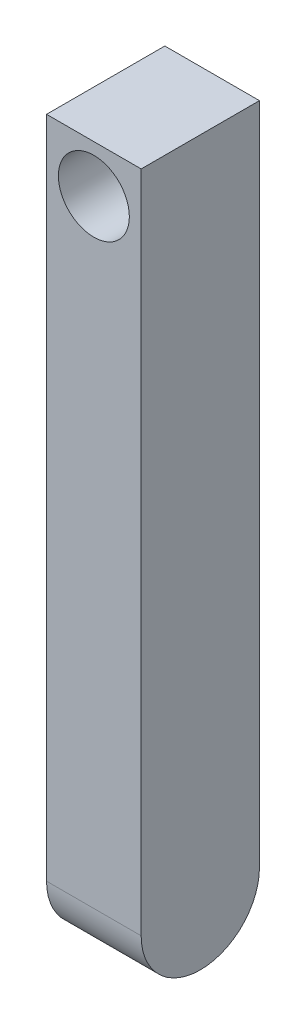
ISO-10303-21;
HEADER;
FILE_DESCRIPTION(('STEP AP214'),'2;1');
FILE_NAME('part.step','',(''),(''),'','','');
FILE_SCHEMA(('AUTOMOTIVE_DESIGN { 1 0 10303 214 1 1 1 1 }'));
ENDSEC;
DATA;
#1=APPLICATION_CONTEXT('core data for automotive mechanical design processes');
#2=APPLICATION_PROTOCOL_DEFINITION('international standard','automotive_design',2000,#1);
#3=PRODUCT_CONTEXT('',#1,'mechanical');
#4=PRODUCT('Part','Part','',(#3));
#5=PRODUCT_RELATED_PRODUCT_CATEGORY('part','',(#4));
#6=PRODUCT_DEFINITION_FORMATION('','',#4);
#7=PRODUCT_DEFINITION_CONTEXT('part definition',#1,'design');
#8=PRODUCT_DEFINITION('design','',#6,#7);
#9=PRODUCT_DEFINITION_SHAPE('','',#8);
#10=(LENGTH_UNIT() NAMED_UNIT(*) SI_UNIT(.MILLI.,.METRE.));
#11=(NAMED_UNIT(*) PLANE_ANGLE_UNIT() SI_UNIT($,.RADIAN.));
#12=(NAMED_UNIT(*) SI_UNIT($,.STERADIAN.) SOLID_ANGLE_UNIT());
#13=UNCERTAINTY_MEASURE_WITH_UNIT(LENGTH_MEASURE(1.E-05),#10,'distance_accuracy_value','');
#14=(GEOMETRIC_REPRESENTATION_CONTEXT(3) GLOBAL_UNCERTAINTY_ASSIGNED_CONTEXT((#13)) GLOBAL_UNIT_ASSIGNED_CONTEXT((#10,
#11,#12)) REPRESENTATION_CONTEXT('',''));
#15=CARTESIAN_POINT('',(0.,0.,0.));
#16=DIRECTION('',(0.,0.,1.));
#17=DIRECTION('',(1.,0.,0.));
#18=AXIS2_PLACEMENT_3D('',#15,#16,#17);
#19=CARTESIAN_POINT('',(0.,0.,100.));
#20=DIRECTION('',(0.,0.,1.));
#21=DIRECTION('',(1.,0.,0.));
#22=AXIS2_PLACEMENT_3D('',#19,#20,#21);
#23=PLANE('',#22);
#24=DIRECTION('',(0.,-1.,0.));
#25=VECTOR('',#24,1.);
#26=CARTESIAN_POINT('',(-37.6696208263638,540.470418357068,100.));
#27=LINE('',#26,#25);
#28=CARTESIAN_POINT('',(-37.6696208263638,540.470418357068,100.));
#29=VERTEX_POINT('',#28);
#30=CARTESIAN_POINT('',(-37.6696208263638,-21.0295816429317,100.));
#31=VERTEX_POINT('',#30);
#32=EDGE_CURVE('E86',#29,#31,#27,.T.);
#33=ORIENTED_EDGE('',*,*,#32,.T.);
#34=DIRECTION('',(1.,0.,0.));
#35=VECTOR('',#34,1.);
#36=CARTESIAN_POINT('',(42.3303791736362,-21.0295816429317,100.));
#37=LINE('',#36,#35);
#38=CARTESIAN_POINT('',(42.3303791736362,-21.0295816429317,100.));
#39=VERTEX_POINT('',#38);
#40=EDGE_CURVE('E11',#31,#39,#37,.T.);
#41=ORIENTED_EDGE('',*,*,#40,.T.);
#42=DIRECTION('',(0.,1.,0.));
#43=VECTOR('',#42,1.);
#44=CARTESIAN_POINT('',(42.3303791736362,540.470418357068,100.));
#45=LINE('',#44,#43);
#46=CARTESIAN_POINT('',(42.3303791736362,540.470418357068,100.));
#47=VERTEX_POINT('',#46);
#48=EDGE_CURVE('E77',#39,#47,#45,.T.);
#49=ORIENTED_EDGE('',*,*,#48,.T.);
#50=DIRECTION('',(-1.,0.,0.));
#51=VECTOR('',#50,1.);
#52=CARTESIAN_POINT('',(-37.6696208263638,540.470418357068,100.));
#53=LINE('',#52,#51);
#54=EDGE_CURVE('E81',#47,#29,#53,.T.);
#55=ORIENTED_EDGE('',*,*,#54,.T.);
#56=EDGE_LOOP('',(#33,#41,#49,#55));
#57=FACE_BOUND('',#56,.T.);
#58=CARTESIAN_POINT('',(2.33037917363618,500.470418357068,100.));
#59=DIRECTION('',(0.,0.,1.));
#60=DIRECTION('',(1.,0.,0.));
#61=AXIS2_PLACEMENT_3D('',#58,#59,#60);
#62=CIRCLE('',#61,30.);
#63=CARTESIAN_POINT('',(32.3303791736362,500.470418357068,100.));
#64=VERTEX_POINT('',#63);
#65=EDGE_CURVE('E106',#64,#64,#62,.T.);
#66=ORIENTED_EDGE('',*,*,#65,.F.);
#67=EDGE_LOOP('',(#66));
#68=FACE_BOUND('',#67,.T.);
#69=ADVANCED_FACE('F33',(#57,#68),#23,.T.);
#70=CARTESIAN_POINT('',(0.,0.,0.));
#71=DIRECTION('',(0.,0.,1.));
#72=DIRECTION('',(1.,0.,0.));
#73=AXIS2_PLACEMENT_3D('',#70,#71,#72);
#74=PLANE('',#73);
#75=DIRECTION('',(0.,1.,0.));
#76=VECTOR('',#75,1.);
#77=CARTESIAN_POINT('',(42.3303791736362,540.470418357068,0.));
#78=LINE('',#77,#76);
#79=CARTESIAN_POINT('',(42.3303791736362,-21.0295816429317,0.));
#80=VERTEX_POINT('',#79);
#81=CARTESIAN_POINT('',(42.3303791736362,540.470418357068,0.));
#82=VERTEX_POINT('',#81);
#83=EDGE_CURVE('E92',#80,#82,#78,.T.);
#84=ORIENTED_EDGE('',*,*,#83,.F.);
#85=DIRECTION('',(1.,0.,0.));
#86=VECTOR('',#85,1.);
#87=CARTESIAN_POINT('',(0.,-21.0295816429317,0.));
#88=LINE('',#87,#86);
#89=CARTESIAN_POINT('',(-37.6696208263638,-21.0295816429317,0.));
#90=VERTEX_POINT('',#89);
#91=EDGE_CURVE('E113',#80,#90,#88,.F.);
#92=ORIENTED_EDGE('',*,*,#91,.T.);
#93=DIRECTION('',(0.,-1.,0.));
#94=VECTOR('',#93,1.);
#95=CARTESIAN_POINT('',(-37.6696208263638,540.470418357068,0.));
#96=LINE('',#95,#94);
#97=CARTESIAN_POINT('',(-37.6696208263638,540.470418357068,0.));
#98=VERTEX_POINT('',#97);
#99=EDGE_CURVE('E104',#98,#90,#96,.T.);
#100=ORIENTED_EDGE('',*,*,#99,.F.);
#101=DIRECTION('',(-1.,0.,0.));
#102=VECTOR('',#101,1.);
#103=CARTESIAN_POINT('',(-37.6696208263638,540.470418357068,0.));
#104=LINE('',#103,#102);
#105=EDGE_CURVE('E108',#82,#98,#104,.T.);
#106=ORIENTED_EDGE('',*,*,#105,.F.);
#107=EDGE_LOOP('',(#84,#92,#100,#106));
#108=FACE_BOUND('',#107,.T.);
#109=CARTESIAN_POINT('',(2.33037917363618,500.470418357068,0.));
#110=DIRECTION('',(0.,0.,1.));
#111=DIRECTION('',(1.,0.,0.));
#112=AXIS2_PLACEMENT_3D('',#109,#110,#111);
#113=CIRCLE('',#112,30.);
#114=CARTESIAN_POINT('',(32.3303791736362,500.470418357068,0.));
#115=VERTEX_POINT('',#114);
#116=EDGE_CURVE('E126',#115,#115,#113,.T.);
#117=ORIENTED_EDGE('',*,*,#116,.T.);
#118=EDGE_LOOP('',(#117));
#119=FACE_BOUND('',#118,.T.);
#120=ADVANCED_FACE('F120',(#108,#119),#74,.F.);
#121=CARTESIAN_POINT('',(-37.6696208263638,540.470418357068,100.));
#122=DIRECTION('',(1.,0.,0.));
#123=DIRECTION('',(0.,1.,0.));
#124=AXIS2_PLACEMENT_3D('',#121,#122,#123);
#125=PLANE('',#124);
#126=ORIENTED_EDGE('',*,*,#99,.T.);
#127=CARTESIAN_POINT('',(-37.6696208263638,-21.0295816429317,50.));
#128=DIRECTION('',(1.,0.,0.));
#129=DIRECTION('',(0.,1.,0.));
#130=AXIS2_PLACEMENT_3D('',#127,#128,#129);
#131=CIRCLE('',#130,50.);
#132=CARTESIAN_POINT('',(-37.6696208263638,-71.0295816429317,50.));
#133=VERTEX_POINT('',#132);
#134=EDGE_CURVE('E42',#90,#133,#131,.F.);
#135=ORIENTED_EDGE('',*,*,#134,.T.);
#136=CARTESIAN_POINT('',(-37.6696208263638,-21.0295816429317,50.));
#137=DIRECTION('',(1.,0.,0.));
#138=DIRECTION('',(0.,1.,0.));
#139=AXIS2_PLACEMENT_3D('',#136,#137,#138);
#140=CIRCLE('',#139,50.);
#141=EDGE_CURVE('E49',#133,#31,#140,.F.);
#142=ORIENTED_EDGE('',*,*,#141,.T.);
#143=ORIENTED_EDGE('',*,*,#32,.F.);
#144=DIRECTION('',(0.,0.,-1.));
#145=VECTOR('',#144,1.);
#146=CARTESIAN_POINT('',(-37.6696208263638,540.470418357068,100.));
#147=LINE('',#146,#145);
#148=EDGE_CURVE('E96',#29,#98,#147,.T.);
#149=ORIENTED_EDGE('',*,*,#148,.T.);
#150=EDGE_LOOP('',(#126,#135,#142,#143,#149));
#151=FACE_BOUND('',#150,.T.);
#152=ADVANCED_FACE('F124',(#151),#125,.F.);
#153=CARTESIAN_POINT('',(42.3303791736362,540.470418357068,100.));
#154=DIRECTION('',(-1.,0.,0.));
#155=DIRECTION('',(0.,-1.,0.));
#156=AXIS2_PLACEMENT_3D('',#153,#154,#155);
#157=PLANE('',#156);
#158=CARTESIAN_POINT('',(42.3303791736362,-21.0295816429317,50.));
#159=DIRECTION('',(-1.,0.,0.));
#160=DIRECTION('',(0.,-1.,0.));
#161=AXIS2_PLACEMENT_3D('',#158,#159,#160);
#162=CIRCLE('',#161,50.);
#163=CARTESIAN_POINT('',(42.3303791736362,-71.0295816429317,50.));
#164=VERTEX_POINT('',#163);
#165=EDGE_CURVE('E95',#39,#164,#162,.F.);
#166=ORIENTED_EDGE('',*,*,#165,.T.);
#167=CARTESIAN_POINT('',(42.3303791736362,-21.0295816429317,50.));
#168=DIRECTION('',(-1.,0.,0.));
#169=DIRECTION('',(0.,-1.,0.));
#170=AXIS2_PLACEMENT_3D('',#167,#168,#169);
#171=CIRCLE('',#170,50.);
#172=EDGE_CURVE('E111',#164,#80,#171,.F.);
#173=ORIENTED_EDGE('',*,*,#172,.T.);
#174=ORIENTED_EDGE('',*,*,#83,.T.);
#175=DIRECTION('',(0.,0.,-1.));
#176=VECTOR('',#175,1.);
#177=CARTESIAN_POINT('',(42.3303791736362,540.470418357068,100.));
#178=LINE('',#177,#176);
#179=EDGE_CURVE('E89',#47,#82,#178,.T.);
#180=ORIENTED_EDGE('',*,*,#179,.F.);
#181=ORIENTED_EDGE('',*,*,#48,.F.);
#182=EDGE_LOOP('',(#166,#173,#174,#180,#181));
#183=FACE_BOUND('',#182,.T.);
#184=ADVANCED_FACE('F90',(#183),#157,.F.);
#185=CARTESIAN_POINT('',(-37.6696208263638,540.470418357068,100.));
#186=DIRECTION('',(0.,-1.,0.));
#187=DIRECTION('',(0.,0.,-1.));
#188=AXIS2_PLACEMENT_3D('',#185,#186,#187);
#189=PLANE('',#188);
#190=ORIENTED_EDGE('',*,*,#105,.T.);
#191=ORIENTED_EDGE('',*,*,#148,.F.);
#192=ORIENTED_EDGE('',*,*,#54,.F.);
#193=ORIENTED_EDGE('',*,*,#179,.T.);
#194=EDGE_LOOP('',(#190,#191,#192,#193));
#195=FACE_BOUND('',#194,.T.);
#196=ADVANCED_FACE('F98',(#195),#189,.F.);
#197=CARTESIAN_POINT('',(2.33037917363618,500.470418357068,100.));
#198=DIRECTION('',(0.,0.,-1.));
#199=DIRECTION('',(-1.,0.,0.));
#200=AXIS2_PLACEMENT_3D('',#197,#198,#199);
#201=CYLINDRICAL_SURFACE('',#200,30.);
#202=ORIENTED_EDGE('',*,*,#65,.T.);
#203=EDGE_LOOP('',(#202));
#204=FACE_BOUND('',#203,.T.);
#205=ORIENTED_EDGE('',*,*,#116,.F.);
#206=EDGE_LOOP('',(#205));
#207=FACE_BOUND('',#206,.T.);
#208=ADVANCED_FACE('F132',(#204,#207),#201,.F.);
#209=CARTESIAN_POINT('',(0.,-21.0295816429317,50.));
#210=DIRECTION('',(-1.,0.,0.));
#211=DIRECTION('',(0.,0.,1.));
#212=AXIS2_PLACEMENT_3D('',#209,#210,#211);
#213=CYLINDRICAL_SURFACE('',#212,50.);
#214=ORIENTED_EDGE('',*,*,#40,.F.);
#215=ORIENTED_EDGE('',*,*,#141,.F.);
#216=DIRECTION('',(1.,0.,0.));
#217=VECTOR('',#216,1.);
#218=CARTESIAN_POINT('',(-37.6696208263638,-71.0295816429317,50.));
#219=LINE('',#218,#217);
#220=EDGE_CURVE('E37',#164,#133,#219,.F.);
#221=ORIENTED_EDGE('',*,*,#220,.F.);
#222=ORIENTED_EDGE('',*,*,#165,.F.);
#223=EDGE_LOOP('',(#214,#215,#221,#222));
#224=FACE_BOUND('',#223,.T.);
#225=ADVANCED_FACE('F35',(#224),#213,.T.);
#226=CARTESIAN_POINT('',(-37.6696208263638,-21.0295816429317,50.));
#227=DIRECTION('',(1.,0.,0.));
#228=DIRECTION('',(0.,0.,-1.));
#229=AXIS2_PLACEMENT_3D('',#226,#227,#228);
#230=CYLINDRICAL_SURFACE('',#229,50.);
#231=ORIENTED_EDGE('',*,*,#134,.F.);
#232=ORIENTED_EDGE('',*,*,#91,.F.);
#233=ORIENTED_EDGE('',*,*,#172,.F.);
#234=ORIENTED_EDGE('',*,*,#220,.T.);
#235=EDGE_LOOP('',(#231,#232,#233,#234));
#236=FACE_BOUND('',#235,.T.);
#237=ADVANCED_FACE('F147',(#236),#230,.T.);
#238=CLOSED_SHELL('',(#69,#120,#152,#184,#196,#208,#225,#237));
#239=MANIFOLD_SOLID_BREP('B2',#238);
#240=ADVANCED_BREP_SHAPE_REPRESENTATION('',(#18,#239),#14);
#241=SHAPE_DEFINITION_REPRESENTATION(#9,#240);
ENDSEC;
END-ISO-10303-21;
